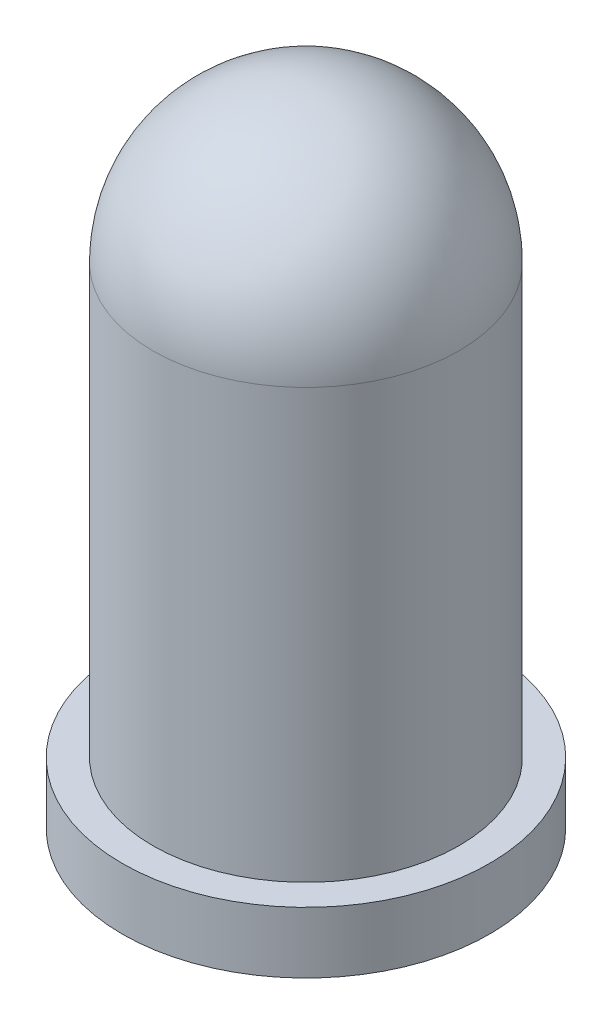
ISO-10303-21;
HEADER;
FILE_DESCRIPTION(('STEP AP214'),'2;1');
FILE_NAME('part.step','',(''),(''),'','','');
FILE_SCHEMA(('AUTOMOTIVE_DESIGN { 1 0 10303 214 1 1 1 1 }'));
ENDSEC;
DATA;
#1=APPLICATION_CONTEXT('core data for automotive mechanical design processes');
#2=APPLICATION_PROTOCOL_DEFINITION('international standard','automotive_design',2000,#1);
#3=PRODUCT_CONTEXT('',#1,'mechanical');
#4=PRODUCT('Part','Part','',(#3));
#5=PRODUCT_RELATED_PRODUCT_CATEGORY('part','',(#4));
#6=PRODUCT_DEFINITION_FORMATION('','',#4);
#7=PRODUCT_DEFINITION_CONTEXT('part definition',#1,'design');
#8=PRODUCT_DEFINITION('design','',#6,#7);
#9=PRODUCT_DEFINITION_SHAPE('','',#8);
#10=(LENGTH_UNIT() NAMED_UNIT(*) SI_UNIT(.MILLI.,.METRE.));
#11=(NAMED_UNIT(*) PLANE_ANGLE_UNIT() SI_UNIT($,.RADIAN.));
#12=(NAMED_UNIT(*) SI_UNIT($,.STERADIAN.) SOLID_ANGLE_UNIT());
#13=UNCERTAINTY_MEASURE_WITH_UNIT(LENGTH_MEASURE(1.E-05),#10,'distance_accuracy_value','');
#14=(GEOMETRIC_REPRESENTATION_CONTEXT(3) GLOBAL_UNCERTAINTY_ASSIGNED_CONTEXT((#13)) GLOBAL_UNIT_ASSIGNED_CONTEXT((#10,
#11,#12)) REPRESENTATION_CONTEXT('',''));
#15=CARTESIAN_POINT('',(0.,0.,0.));
#16=DIRECTION('',(0.,0.,1.));
#17=DIRECTION('',(1.,0.,0.));
#18=AXIS2_PLACEMENT_3D('',#15,#16,#17);
#19=CARTESIAN_POINT('',(0.,50.5227127247536,0.));
#20=DIRECTION('',(0.,1.,0.));
#21=DIRECTION('',(-1.,0.,0.));
#22=AXIS2_PLACEMENT_3D('',#19,#20,#21);
#23=SPHERICAL_SURFACE('',#22,2.5);
#24=CARTESIAN_POINT('',(0.,50.5227127247536,0.));
#25=DIRECTION('',(0.,1.,0.));
#26=DIRECTION('',(0.,0.,1.));
#27=AXIS2_PLACEMENT_3D('',#24,#25,#26);
#28=CIRCLE('',#27,2.5);
#29=CARTESIAN_POINT('',(0.,50.5227127247536,2.5));
#30=VERTEX_POINT('',#29);
#31=EDGE_CURVE('E46',#30,#30,#28,.T.);
#32=ORIENTED_EDGE('',*,*,#31,.T.);
#33=EDGE_LOOP('',(#32));
#34=FACE_BOUND('',#33,.T.);
#35=ADVANCED_FACE('F32',(#34),#23,.T.);
#36=CARTESIAN_POINT('',(0.,42.5227127247536,0.));
#37=DIRECTION('',(0.,1.,0.));
#38=DIRECTION('',(0.,0.,1.));
#39=AXIS2_PLACEMENT_3D('',#36,#37,#38);
#40=PLANE('',#39);
#41=CARTESIAN_POINT('',(0.,42.5227127247536,0.));
#42=DIRECTION('',(0.,1.,0.));
#43=DIRECTION('',(0.,0.,1.));
#44=AXIS2_PLACEMENT_3D('',#41,#42,#43);
#45=CIRCLE('',#44,2.99999999999999);
#46=CARTESIAN_POINT('',(0.,42.5227127247536,2.99999999999999));
#47=VERTEX_POINT('',#46);
#48=EDGE_CURVE('E10',#47,#47,#45,.T.);
#49=ORIENTED_EDGE('',*,*,#48,.F.);
#50=EDGE_LOOP('',(#49));
#51=FACE_BOUND('',#50,.T.);
#52=ADVANCED_FACE('F64',(#51),#40,.F.);
#53=CARTESIAN_POINT('',(0.,78.413353264364,0.));
#54=DIRECTION('',(0.,1.,0.));
#55=DIRECTION('',(0.,0.,1.));
#56=AXIS2_PLACEMENT_3D('',#53,#54,#55);
#57=CYLINDRICAL_SURFACE('',#56,3.);
#58=CARTESIAN_POINT('',(0.,43.5227127247536,0.));
#59=DIRECTION('',(0.,1.,0.));
#60=DIRECTION('',(0.,0.,1.));
#61=AXIS2_PLACEMENT_3D('',#58,#59,#60);
#62=CIRCLE('',#61,3.00000000000001);
#63=CARTESIAN_POINT('',(0.,43.5227127247536,3.00000000000001));
#64=VERTEX_POINT('',#63);
#65=EDGE_CURVE('E38',#64,#64,#62,.T.);
#66=ORIENTED_EDGE('',*,*,#65,.F.);
#67=EDGE_LOOP('',(#66));
#68=FACE_BOUND('',#67,.T.);
#69=ORIENTED_EDGE('',*,*,#48,.T.);
#70=EDGE_LOOP('',(#69));
#71=FACE_BOUND('',#70,.T.);
#72=ADVANCED_FACE('F61',(#68,#71),#57,.T.);
#73=CARTESIAN_POINT('',(0.,43.5227127247536,0.));
#74=DIRECTION('',(0.,1.,0.));
#75=DIRECTION('',(0.,0.,1.));
#76=AXIS2_PLACEMENT_3D('',#73,#74,#75);
#77=PLANE('',#76);
#78=ORIENTED_EDGE('',*,*,#65,.T.);
#79=EDGE_LOOP('',(#78));
#80=FACE_BOUND('',#79,.T.);
#81=CARTESIAN_POINT('',(0.,43.5227127247536,0.));
#82=DIRECTION('',(0.,1.,0.));
#83=DIRECTION('',(0.,0.,1.));
#84=AXIS2_PLACEMENT_3D('',#81,#82,#83);
#85=CIRCLE('',#84,2.50000000000001);
#86=CARTESIAN_POINT('',(0.,43.5227127247536,2.50000000000001));
#87=VERTEX_POINT('',#86);
#88=EDGE_CURVE('E42',#87,#87,#85,.T.);
#89=ORIENTED_EDGE('',*,*,#88,.F.);
#90=EDGE_LOOP('',(#89));
#91=FACE_BOUND('',#90,.T.);
#92=ADVANCED_FACE('F55',(#80,#91),#77,.T.);
#93=CARTESIAN_POINT('',(0.,78.413353264364,0.));
#94=DIRECTION('',(0.,1.,0.));
#95=DIRECTION('',(0.,0.,1.));
#96=AXIS2_PLACEMENT_3D('',#93,#94,#95);
#97=CYLINDRICAL_SURFACE('',#96,2.5);
#98=ORIENTED_EDGE('',*,*,#88,.T.);
#99=EDGE_LOOP('',(#98));
#100=FACE_BOUND('',#99,.T.);
#101=ORIENTED_EDGE('',*,*,#31,.F.);
#102=EDGE_LOOP('',(#101));
#103=FACE_BOUND('',#102,.T.);
#104=ADVANCED_FACE('F53',(#100,#103),#97,.T.);
#105=CLOSED_SHELL('',(#35,#52,#72,#92,#104));
#106=MANIFOLD_SOLID_BREP('B2',#105);
#107=ADVANCED_BREP_SHAPE_REPRESENTATION('',(#18,#106),#14);
#108=SHAPE_DEFINITION_REPRESENTATION(#9,#107);
ENDSEC;
END-ISO-10303-21;
